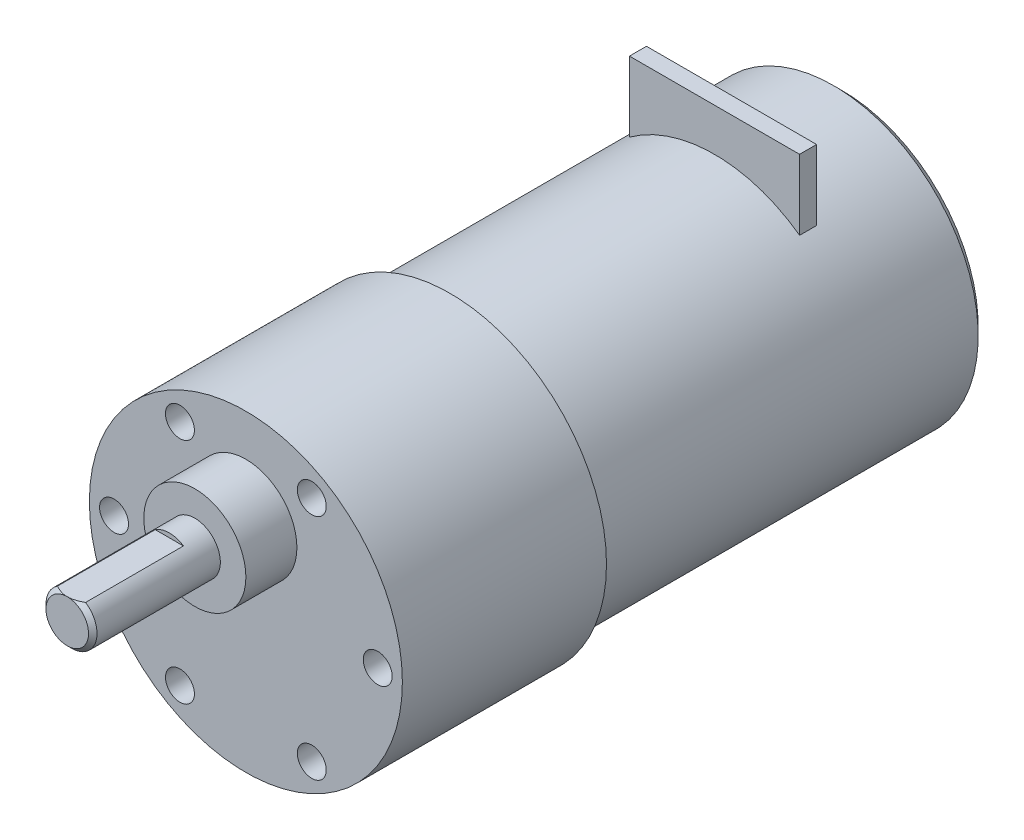
ISO-10303-21;
HEADER;
FILE_DESCRIPTION(('STEP AP214'),'2;1');
FILE_NAME('part.step','',(''),(''),'','','');
FILE_SCHEMA(('AUTOMOTIVE_DESIGN { 1 0 10303 214 1 1 1 1 }'));
ENDSEC;
DATA;
#1=APPLICATION_CONTEXT('core data for automotive mechanical design processes');
#2=APPLICATION_PROTOCOL_DEFINITION('international standard','automotive_design',2000,#1);
#3=PRODUCT_CONTEXT('',#1,'mechanical');
#4=PRODUCT('Part','Part','',(#3));
#5=PRODUCT_RELATED_PRODUCT_CATEGORY('part','',(#4));
#6=PRODUCT_DEFINITION_FORMATION('','',#4);
#7=PRODUCT_DEFINITION_CONTEXT('part definition',#1,'design');
#8=PRODUCT_DEFINITION('design','',#6,#7);
#9=PRODUCT_DEFINITION_SHAPE('','',#8);
#10=(LENGTH_UNIT() NAMED_UNIT(*) SI_UNIT(.MILLI.,.METRE.));
#11=(NAMED_UNIT(*) PLANE_ANGLE_UNIT() SI_UNIT($,.RADIAN.));
#12=(NAMED_UNIT(*) SI_UNIT($,.STERADIAN.) SOLID_ANGLE_UNIT());
#13=UNCERTAINTY_MEASURE_WITH_UNIT(LENGTH_MEASURE(1.E-05),#10,'distance_accuracy_value','');
#14=(GEOMETRIC_REPRESENTATION_CONTEXT(3) GLOBAL_UNCERTAINTY_ASSIGNED_CONTEXT((#13)) GLOBAL_UNIT_ASSIGNED_CONTEXT((#10,
#11,#12)) REPRESENTATION_CONTEXT('',''));
#15=CARTESIAN_POINT('',(0.,0.,0.));
#16=DIRECTION('',(0.,0.,1.));
#17=DIRECTION('',(1.,0.,0.));
#18=AXIS2_PLACEMENT_3D('',#15,#16,#17);
#19=CARTESIAN_POINT('',(0.,0.,-46.1));
#20=DIRECTION('',(0.,0.,1.));
#21=DIRECTION('',(1.,0.,0.));
#22=AXIS2_PLACEMENT_3D('',#19,#20,#21);
#23=CYLINDRICAL_SURFACE('',#22,17.);
#24=CARTESIAN_POINT('',(0.,0.,0.));
#25=DIRECTION('',(0.,0.,-1.));
#26=DIRECTION('',(-1.,0.,0.));
#27=AXIS2_PLACEMENT_3D('',#24,#25,#26);
#28=CIRCLE('',#27,17.);
#29=CARTESIAN_POINT('',(-17.,0.,0.));
#30=VERTEX_POINT('',#29);
#31=EDGE_CURVE('E198',#30,#30,#28,.T.);
#32=ORIENTED_EDGE('',*,*,#31,.T.);
#33=EDGE_LOOP('',(#32));
#34=FACE_BOUND('',#33,.T.);
#35=CARTESIAN_POINT('',(0.,0.,-45.1));
#36=DIRECTION('',(0.,0.,-1.));
#37=DIRECTION('',(-1.,0.,0.));
#38=AXIS2_PLACEMENT_3D('',#35,#36,#37);
#39=CIRCLE('',#38,17.);
#40=CARTESIAN_POINT('',(-17.,0.,-45.1));
#41=VERTEX_POINT('',#40);
#42=EDGE_CURVE('E191',#41,#41,#39,.F.);
#43=ORIENTED_EDGE('',*,*,#42,.T.);
#44=EDGE_LOOP('',(#43));
#45=FACE_BOUND('',#44,.T.);
#46=DIRECTION('',(0.,0.,1.));
#47=VECTOR('',#46,1.);
#48=CARTESIAN_POINT('',(-10.,13.7477270848675,-46.1));
#49=LINE('',#48,#47);
#50=CARTESIAN_POINT('',(-10.,13.7477270848675,-33.1));
#51=VERTEX_POINT('',#50);
#52=CARTESIAN_POINT('',(-10.,13.7477270848675,-31.1));
#53=VERTEX_POINT('',#52);
#54=EDGE_CURVE('E11',#51,#53,#49,.T.);
#55=ORIENTED_EDGE('',*,*,#54,.F.);
#56=CARTESIAN_POINT('',(0.,0.,-33.1));
#57=DIRECTION('',(0.,0.,1.));
#58=DIRECTION('',(1.,0.,0.));
#59=AXIS2_PLACEMENT_3D('',#56,#57,#58);
#60=CIRCLE('',#59,17.);
#61=CARTESIAN_POINT('',(10.,13.7477270848675,-33.1));
#62=VERTEX_POINT('',#61);
#63=EDGE_CURVE('E283',#62,#51,#60,.T.);
#64=ORIENTED_EDGE('',*,*,#63,.F.);
#65=DIRECTION('',(0.,0.,1.));
#66=VECTOR('',#65,1.);
#67=CARTESIAN_POINT('',(10.,13.7477270848675,-46.1));
#68=LINE('',#67,#66);
#69=CARTESIAN_POINT('',(10.,13.7477270848675,-31.1));
#70=VERTEX_POINT('',#69);
#71=EDGE_CURVE('E61',#70,#62,#68,.F.);
#72=ORIENTED_EDGE('',*,*,#71,.F.);
#73=CARTESIAN_POINT('',(0.,0.,-31.1));
#74=DIRECTION('',(0.,0.,-1.));
#75=DIRECTION('',(-1.,0.,0.));
#76=AXIS2_PLACEMENT_3D('',#73,#74,#75);
#77=CIRCLE('',#76,17.);
#78=EDGE_CURVE('E51',#53,#70,#77,.T.);
#79=ORIENTED_EDGE('',*,*,#78,.F.);
#80=EDGE_LOOP('',(#55,#64,#72,#79));
#81=FACE_BOUND('',#80,.T.);
#82=ADVANCED_FACE('F41',(#34,#45,#81),#23,.T.);
#83=CARTESIAN_POINT('',(0.,0.,24.));
#84=DIRECTION('',(0.,0.,-1.));
#85=DIRECTION('',(-1.,0.,0.));
#86=AXIS2_PLACEMENT_3D('',#83,#84,#85);
#87=CYLINDRICAL_SURFACE('',#86,18.4);
#88=CARTESIAN_POINT('',(0.,0.,24.));
#89=DIRECTION('',(0.,0.,1.));
#90=DIRECTION('',(1.,0.,0.));
#91=AXIS2_PLACEMENT_3D('',#88,#89,#90);
#92=CIRCLE('',#91,18.4);
#93=CARTESIAN_POINT('',(18.4,0.,24.));
#94=VERTEX_POINT('',#93);
#95=EDGE_CURVE('E202',#94,#94,#92,.T.);
#96=ORIENTED_EDGE('',*,*,#95,.F.);
#97=EDGE_LOOP('',(#96));
#98=FACE_BOUND('',#97,.T.);
#99=CARTESIAN_POINT('',(0.,0.,0.));
#100=DIRECTION('',(0.,0.,1.));
#101=DIRECTION('',(1.,0.,0.));
#102=AXIS2_PLACEMENT_3D('',#99,#100,#101);
#103=CIRCLE('',#102,18.4);
#104=CARTESIAN_POINT('',(18.4,0.,0.));
#105=VERTEX_POINT('',#104);
#106=EDGE_CURVE('E195',#105,#105,#103,.T.);
#107=ORIENTED_EDGE('',*,*,#106,.T.);
#108=EDGE_LOOP('',(#107));
#109=FACE_BOUND('',#108,.T.);
#110=ADVANCED_FACE('F260',(#98,#109),#87,.T.);
#111=CARTESIAN_POINT('',(0.,0.,24.));
#112=DIRECTION('',(0.,0.,1.));
#113=DIRECTION('',(1.,0.,0.));
#114=AXIS2_PLACEMENT_3D('',#111,#112,#113);
#115=PLANE('',#114);
#116=CARTESIAN_POINT('',(-7.75000000000016,-13.4233937586587,24.));
#117=DIRECTION('',(0.,0.,1.));
#118=DIRECTION('',(1.,0.,0.));
#119=AXIS2_PLACEMENT_3D('',#116,#117,#118);
#120=CIRCLE('',#119,1.69999999999999);
#121=CARTESIAN_POINT('',(-6.05000000000017,-13.4233937586587,24.));
#122=VERTEX_POINT('',#121);
#123=EDGE_CURVE('E134',#122,#122,#120,.T.);
#124=ORIENTED_EDGE('',*,*,#123,.F.);
#125=EDGE_LOOP('',(#124));
#126=FACE_BOUND('',#125,.T.);
#127=CARTESIAN_POINT('',(7.74999999999987,-13.4233937586589,24.));
#128=DIRECTION('',(0.,0.,1.));
#129=DIRECTION('',(1.,0.,0.));
#130=AXIS2_PLACEMENT_3D('',#127,#128,#129);
#131=CIRCLE('',#130,1.69999999999999);
#132=CARTESIAN_POINT('',(9.44999999999986,-13.4233937586589,24.));
#133=VERTEX_POINT('',#132);
#134=EDGE_CURVE('E145',#133,#133,#131,.T.);
#135=ORIENTED_EDGE('',*,*,#134,.F.);
#136=EDGE_LOOP('',(#135));
#137=FACE_BOUND('',#136,.T.);
#138=CARTESIAN_POINT('',(15.5,0.,24.));
#139=DIRECTION('',(0.,0.,1.));
#140=DIRECTION('',(1.,0.,0.));
#141=AXIS2_PLACEMENT_3D('',#138,#139,#140);
#142=CIRCLE('',#141,1.69999999999999);
#143=CARTESIAN_POINT('',(17.2,0.,24.));
#144=VERTEX_POINT('',#143);
#145=EDGE_CURVE('E151',#144,#144,#142,.T.);
#146=ORIENTED_EDGE('',*,*,#145,.F.);
#147=EDGE_LOOP('',(#146));
#148=FACE_BOUND('',#147,.T.);
#149=CARTESIAN_POINT('',(7.75000000000006,13.4233937586588,24.));
#150=DIRECTION('',(0.,0.,1.));
#151=DIRECTION('',(1.,0.,0.));
#152=AXIS2_PLACEMENT_3D('',#149,#150,#151);
#153=CIRCLE('',#152,1.69999999999999);
#154=CARTESIAN_POINT('',(9.45000000000005,13.4233937586588,24.));
#155=VERTEX_POINT('',#154);
#156=EDGE_CURVE('E157',#155,#155,#153,.T.);
#157=ORIENTED_EDGE('',*,*,#156,.F.);
#158=EDGE_LOOP('',(#157));
#159=FACE_BOUND('',#158,.T.);
#160=CARTESIAN_POINT('',(-7.74999999999997,13.4233937586588,24.));
#161=DIRECTION('',(0.,0.,1.));
#162=DIRECTION('',(1.,0.,0.));
#163=AXIS2_PLACEMENT_3D('',#160,#161,#162);
#164=CIRCLE('',#163,1.69999999999999);
#165=CARTESIAN_POINT('',(-6.04999999999998,13.4233937586588,24.));
#166=VERTEX_POINT('',#165);
#167=EDGE_CURVE('E163',#166,#166,#164,.T.);
#168=ORIENTED_EDGE('',*,*,#167,.F.);
#169=EDGE_LOOP('',(#168));
#170=FACE_BOUND('',#169,.T.);
#171=CARTESIAN_POINT('',(-15.5,0.,24.));
#172=DIRECTION('',(0.,0.,1.));
#173=DIRECTION('',(1.,0.,0.));
#174=AXIS2_PLACEMENT_3D('',#171,#172,#173);
#175=CIRCLE('',#174,1.69999999999999);
#176=CARTESIAN_POINT('',(-13.8,0.,24.));
#177=VERTEX_POINT('',#176);
#178=EDGE_CURVE('E169',#177,#177,#175,.T.);
#179=ORIENTED_EDGE('',*,*,#178,.F.);
#180=EDGE_LOOP('',(#179));
#181=FACE_BOUND('',#180,.T.);
#182=CARTESIAN_POINT('',(0.,7.5,24.));
#183=DIRECTION('',(0.,0.,1.));
#184=DIRECTION('',(1.,0.,0.));
#185=AXIS2_PLACEMENT_3D('',#182,#183,#184);
#186=CIRCLE('',#185,6.);
#187=CARTESIAN_POINT('',(6.,7.5,24.));
#188=VERTEX_POINT('',#187);
#189=EDGE_CURVE('E184',#188,#188,#186,.T.);
#190=ORIENTED_EDGE('',*,*,#189,.F.);
#191=EDGE_LOOP('',(#190));
#192=FACE_BOUND('',#191,.T.);
#193=ORIENTED_EDGE('',*,*,#95,.T.);
#194=EDGE_LOOP('',(#193));
#195=FACE_BOUND('',#194,.T.);
#196=ADVANCED_FACE('F262',(#126,#137,#148,#159,#170,#181,#192,#195),#115,.T.);
#197=CARTESIAN_POINT('',(0.,0.,0.));
#198=DIRECTION('',(0.,0.,1.));
#199=DIRECTION('',(1.,0.,0.));
#200=AXIS2_PLACEMENT_3D('',#197,#198,#199);
#201=PLANE('',#200);
#202=ORIENTED_EDGE('',*,*,#31,.F.);
#203=EDGE_LOOP('',(#202));
#204=FACE_BOUND('',#203,.T.);
#205=ORIENTED_EDGE('',*,*,#106,.F.);
#206=EDGE_LOOP('',(#205));
#207=FACE_BOUND('',#206,.T.);
#208=ADVANCED_FACE('F256',(#204,#207),#201,.F.);
#209=CARTESIAN_POINT('',(0.,0.,-46.1));
#210=DIRECTION('',(0.,0.,-1.));
#211=DIRECTION('',(-1.,0.,0.));
#212=AXIS2_PLACEMENT_3D('',#209,#210,#211);
#213=PLANE('',#212);
#214=CARTESIAN_POINT('',(0.,0.,-46.1));
#215=DIRECTION('',(0.,0.,-1.));
#216=DIRECTION('',(-1.,0.,0.));
#217=AXIS2_PLACEMENT_3D('',#214,#215,#216);
#218=CIRCLE('',#217,16.);
#219=CARTESIAN_POINT('',(-16.,0.,-46.1));
#220=VERTEX_POINT('',#219);
#221=EDGE_CURVE('E201',#220,#220,#218,.T.);
#222=ORIENTED_EDGE('',*,*,#221,.T.);
#223=EDGE_LOOP('',(#222));
#224=FACE_BOUND('',#223,.T.);
#225=ADVANCED_FACE('F253',(#224),#213,.T.);
#226=CARTESIAN_POINT('',(0.,0.,-46.1));
#227=DIRECTION('',(0.,0.,1.));
#228=DIRECTION('',(1.,0.,0.));
#229=AXIS2_PLACEMENT_3D('',#226,#227,#228);
#230=CONICAL_SURFACE('',#229,16.,0.785398163397448);
#231=ORIENTED_EDGE('',*,*,#42,.F.);
#232=EDGE_LOOP('',(#231));
#233=FACE_BOUND('',#232,.T.);
#234=ORIENTED_EDGE('',*,*,#221,.F.);
#235=EDGE_LOOP('',(#234));
#236=FACE_BOUND('',#235,.T.);
#237=ADVANCED_FACE('F251',(#233,#236),#230,.T.);
#238=CARTESIAN_POINT('',(0.,7.5,30.));
#239=DIRECTION('',(0.,0.,-1.));
#240=DIRECTION('',(-1.,0.,0.));
#241=AXIS2_PLACEMENT_3D('',#238,#239,#240);
#242=CYLINDRICAL_SURFACE('',#241,6.);
#243=CARTESIAN_POINT('',(0.,7.5,30.));
#244=DIRECTION('',(0.,0.,1.));
#245=DIRECTION('',(1.,0.,0.));
#246=AXIS2_PLACEMENT_3D('',#243,#244,#245);
#247=CIRCLE('',#246,6.);
#248=CARTESIAN_POINT('',(6.,7.5,30.));
#249=VERTEX_POINT('',#248);
#250=EDGE_CURVE('E192',#249,#249,#247,.T.);
#251=ORIENTED_EDGE('',*,*,#250,.F.);
#252=EDGE_LOOP('',(#251));
#253=FACE_BOUND('',#252,.T.);
#254=ORIENTED_EDGE('',*,*,#189,.T.);
#255=EDGE_LOOP('',(#254));
#256=FACE_BOUND('',#255,.T.);
#257=ADVANCED_FACE('F247',(#253,#256),#242,.T.);
#258=CARTESIAN_POINT('',(0.,7.5,30.));
#259=DIRECTION('',(0.,0.,1.));
#260=DIRECTION('',(1.,0.,0.));
#261=AXIS2_PLACEMENT_3D('',#258,#259,#260);
#262=PLANE('',#261);
#263=CARTESIAN_POINT('',(0.,7.5,30.));
#264=DIRECTION('',(0.,0.,1.));
#265=DIRECTION('',(1.,0.,0.));
#266=AXIS2_PLACEMENT_3D('',#263,#264,#265);
#267=CIRCLE('',#266,3.);
#268=CARTESIAN_POINT('',(3.,7.5,30.));
#269=VERTEX_POINT('',#268);
#270=EDGE_CURVE('E187',#269,#269,#267,.T.);
#271=ORIENTED_EDGE('',*,*,#270,.F.);
#272=EDGE_LOOP('',(#271));
#273=FACE_BOUND('',#272,.T.);
#274=ORIENTED_EDGE('',*,*,#250,.T.);
#275=EDGE_LOOP('',(#274));
#276=FACE_BOUND('',#275,.T.);
#277=ADVANCED_FACE('F243',(#273,#276),#262,.T.);
#278=CARTESIAN_POINT('',(0.,7.5,45.));
#279=DIRECTION('',(0.,0.,-1.));
#280=DIRECTION('',(-1.,0.,0.));
#281=AXIS2_PLACEMENT_3D('',#278,#279,#280);
#282=CYLINDRICAL_SURFACE('',#281,3.);
#283=DIRECTION('',(0.,0.,1.));
#284=VECTOR('',#283,1.);
#285=CARTESIAN_POINT('',(1.6583123951777,10.,33.));
#286=LINE('',#285,#284);
#287=CARTESIAN_POINT('',(1.6583123951777,10.,33.));
#288=VERTEX_POINT('',#287);
#289=CARTESIAN_POINT('',(1.6583123951777,10.,44.5));
#290=VERTEX_POINT('',#289);
#291=EDGE_CURVE('E181',#288,#290,#286,.T.);
#292=ORIENTED_EDGE('',*,*,#291,.T.);
#293=CARTESIAN_POINT('',(0.,7.5,44.5));
#294=DIRECTION('',(0.,0.,1.));
#295=DIRECTION('',(1.,0.,0.));
#296=AXIS2_PLACEMENT_3D('',#293,#294,#295);
#297=CIRCLE('',#296,3.);
#298=CARTESIAN_POINT('',(-1.6583123951777,10.,44.5));
#299=VERTEX_POINT('',#298);
#300=EDGE_CURVE('E289',#290,#299,#297,.F.);
#301=ORIENTED_EDGE('',*,*,#300,.T.);
#302=DIRECTION('',(0.,0.,1.));
#303=VECTOR('',#302,1.);
#304=CARTESIAN_POINT('',(-1.6583123951777,10.,33.));
#305=LINE('',#304,#303);
#306=CARTESIAN_POINT('',(-1.6583123951777,10.,33.));
#307=VERTEX_POINT('',#306);
#308=EDGE_CURVE('E180',#307,#299,#305,.T.);
#309=ORIENTED_EDGE('',*,*,#308,.F.);
#310=CARTESIAN_POINT('',(0.,7.5,33.));
#311=DIRECTION('',(0.,0.,1.));
#312=DIRECTION('',(1.,0.,0.));
#313=AXIS2_PLACEMENT_3D('',#310,#311,#312);
#314=CIRCLE('',#313,3.);
#315=EDGE_CURVE('E175',#288,#307,#314,.T.);
#316=ORIENTED_EDGE('',*,*,#315,.F.);
#317=EDGE_LOOP('',(#292,#301,#309,#316));
#318=FACE_BOUND('',#317,.T.);
#319=ORIENTED_EDGE('',*,*,#270,.T.);
#320=EDGE_LOOP('',(#319));
#321=FACE_BOUND('',#320,.T.);
#322=ADVANCED_FACE('F239',(#318,#321),#282,.T.);
#323=CARTESIAN_POINT('',(0.,7.5,45.));
#324=DIRECTION('',(0.,0.,1.));
#325=DIRECTION('',(1.,0.,0.));
#326=AXIS2_PLACEMENT_3D('',#323,#324,#325);
#327=PLANE('',#326);
#328=CARTESIAN_POINT('',(0.,7.5,45.));
#329=DIRECTION('',(0.,0.,1.));
#330=DIRECTION('',(1.,0.,0.));
#331=AXIS2_PLACEMENT_3D('',#328,#329,#330);
#332=CIRCLE('',#331,2.49999999999998);
#333=CARTESIAN_POINT('',(0.,10.,45.));
#334=VERTEX_POINT('',#333);
#335=EDGE_CURVE('E190',#334,#334,#332,.T.);
#336=ORIENTED_EDGE('',*,*,#335,.T.);
#337=EDGE_LOOP('',(#336));
#338=FACE_BOUND('',#337,.T.);
#339=ADVANCED_FACE('F233',(#338),#327,.T.);
#340=CARTESIAN_POINT('',(0.,10.,33.));
#341=DIRECTION('',(0.,-1.,0.));
#342=DIRECTION('',(0.,0.,-1.));
#343=AXIS2_PLACEMENT_3D('',#340,#341,#342);
#344=PLANE('',#343);
#345=CARTESIAN_POINT('',(-1.6583123951777,10.,44.5));
#346=CARTESIAN_POINT('',(-1.61304419071273,10.,44.5250200255843));
#347=CARTESIAN_POINT('',(-1.56747781751027,10.,44.5494994272189));
#348=CARTESIAN_POINT('',(-1.47571363154992,10.,44.5972096867305));
#349=CARTESIAN_POINT('',(-1.42951600534283,10.,44.6204409038781));
#350=CARTESIAN_POINT('',(-1.28946898250347,10.,44.688233741468));
#351=CARTESIAN_POINT('',(-1.19456817295725,10.,44.7306685534991));
#352=CARTESIAN_POINT('',(-1.00435832661105,10.,44.8071641313578));
#353=CARTESIAN_POINT('',(-0.909128166857113,10.,44.8414185932365));
#354=CARTESIAN_POINT('',(-0.715960996402801,10.,44.9011186383457));
#355=CARTESIAN_POINT('',(-0.618025975916636,10.,44.9265705213043));
#356=CARTESIAN_POINT('',(-0.434096531038001,10.,44.96395141614));
#357=CARTESIAN_POINT('',(-0.348395131920394,10.,44.9772928993308));
#358=CARTESIAN_POINT('',(-0.218706232970862,10.,44.99082665433));
#359=CARTESIAN_POINT('',(-0.175042274887075,10.,44.9942588205655));
#360=CARTESIAN_POINT('',(-0.0875881850216949,10.,44.9988484547413));
#361=CARTESIAN_POINT('',(-0.043798033754819,10.,45.0000055502065));
#362=CARTESIAN_POINT('',(0.,10.,45.));
#363=B_SPLINE_CURVE_WITH_KNOTS('',3,(#345,#346,#347,#348,#349,#350,#351,#352,#353,#354,#355,
#356,#357,#358,#359,#360,#361,#362),.UNSPECIFIED.,.F.,.F.,(4,2,2,2,2,2,2,2,4),(0.,
0.155160114661544,0.310275326953935,0.621889187467569,0.925164565305234,1.22822244720193,
1.48798349653102,1.61932602447731,1.75069005406606),.UNSPECIFIED.);
#364=EDGE_CURVE('E213',#299,#334,#363,.T.);
#365=ORIENTED_EDGE('',*,*,#364,.T.);
#366=CARTESIAN_POINT('',(0.,9.99999999999997,45.));
#367=CARTESIAN_POINT('',(0.0768428391803907,9.99999999999999,45.0000643176381));
#368=CARTESIAN_POINT('',(0.153646619440304,10.,44.9964585669139));
#369=CARTESIAN_POINT('',(0.30648691399063,10.,44.9824138186156));
#370=CARTESIAN_POINT('',(0.382524604614592,10.,44.9719877566791));
#371=CARTESIAN_POINT('',(0.532231201598342,10.,44.9450231886171));
#372=CARTESIAN_POINT('',(0.605918543015126,10.,44.9285851348585));
#373=CARTESIAN_POINT('',(0.751897163106769,10.,44.8903277696489));
#374=CARTESIAN_POINT('',(0.824187885624653,10.,44.8685063602176));
#375=CARTESIAN_POINT('',(0.961361204559374,10.,44.8222417065684));
#376=CARTESIAN_POINT('',(1.02636662586388,10.,44.7981581621012));
#377=CARTESIAN_POINT('',(1.1550556235554,10.,44.7466971992363));
#378=CARTESIAN_POINT('',(1.21873914323977,10.,44.7193196398836));
#379=CARTESIAN_POINT('',(1.34581351001768,10.,44.6613450460911));
#380=CARTESIAN_POINT('',(1.40918435962137,10.,44.6307045192353));
#381=CARTESIAN_POINT('',(1.53466113602633,10.,44.567035036112));
#382=CARTESIAN_POINT('',(1.59676793059764,10.,44.5340077944288));
#383=CARTESIAN_POINT('',(1.6583123951777,10.,44.5));
#384=B_SPLINE_CURVE_WITH_KNOTS('',3,(#366,#367,#368,#369,#370,#371,#372,#373,#374,#375,#376,
#377,#378,#379,#380,#381,#382,#383),.UNSPECIFIED.,.F.,.F.,(4,2,2,2,2,2,2,2,4),(0.,
0.230381722715165,0.460327757459299,0.686595219702824,0.912951001700763,1.12081935764501,
1.32869661170078,1.53981070703046,1.75077462023261),.UNSPECIFIED.);
#385=EDGE_CURVE('E221',#334,#290,#384,.T.);
#386=ORIENTED_EDGE('',*,*,#385,.T.);
#387=ORIENTED_EDGE('',*,*,#291,.F.);
#388=DIRECTION('',(1.,0.,0.));
#389=VECTOR('',#388,1.);
#390=CARTESIAN_POINT('',(0.,10.,33.));
#391=LINE('',#390,#389);
#392=EDGE_CURVE('E177',#307,#288,#391,.T.);
#393=ORIENTED_EDGE('',*,*,#392,.F.);
#394=ORIENTED_EDGE('',*,*,#308,.T.);
#395=EDGE_LOOP('',(#365,#386,#387,#393,#394));
#396=FACE_BOUND('',#395,.T.);
#397=ADVANCED_FACE('F227',(#396),#344,.F.);
#398=CARTESIAN_POINT('',(0.,0.,33.));
#399=DIRECTION('',(0.,0.,1.));
#400=DIRECTION('',(1.,0.,0.));
#401=AXIS2_PLACEMENT_3D('',#398,#399,#400);
#402=PLANE('',#401);
#403=ORIENTED_EDGE('',*,*,#315,.T.);
#404=ORIENTED_EDGE('',*,*,#392,.T.);
#405=EDGE_LOOP('',(#403,#404));
#406=FACE_BOUND('',#405,.T.);
#407=ADVANCED_FACE('F232',(#406),#402,.T.);
#408=CARTESIAN_POINT('',(0.,7.5,45.));
#409=DIRECTION('',(0.,0.,-1.));
#410=DIRECTION('',(-1.,0.,0.));
#411=AXIS2_PLACEMENT_3D('',#408,#409,#410);
#412=CONICAL_SURFACE('',#411,2.49999999999997,0.785398163397452);
#413=ORIENTED_EDGE('',*,*,#364,.F.);
#414=ORIENTED_EDGE('',*,*,#300,.F.);
#415=ORIENTED_EDGE('',*,*,#385,.F.);
#416=ORIENTED_EDGE('',*,*,#335,.F.);
#417=EDGE_LOOP('',(#413,#414,#415,#416));
#418=FACE_BOUND('',#417,.T.);
#419=ADVANCED_FACE('F44',(#418),#412,.T.);
#420=CARTESIAN_POINT('',(-15.5,0.,20.5));
#421=DIRECTION('',(0.,0.,1.));
#422=DIRECTION('',(1.,0.,0.));
#423=AXIS2_PLACEMENT_3D('',#420,#421,#422);
#424=CONICAL_SURFACE('',#423,1.7,1.02974425867665);
#425=CARTESIAN_POINT('',(-15.5,0.,19.4785369476531));
#426=VERTEX_POINT('',#425);
#427=VERTEX_LOOP('',#426);
#428=FACE_BOUND('',#427,.T.);
#429=CARTESIAN_POINT('',(-15.5,0.,20.5));
#430=DIRECTION('',(0.,0.,1.));
#431=DIRECTION('',(1.,0.,0.));
#432=AXIS2_PLACEMENT_3D('',#429,#430,#431);
#433=CIRCLE('',#432,1.7);
#434=CARTESIAN_POINT('',(-13.8,0.,20.5));
#435=VERTEX_POINT('',#434);
#436=EDGE_CURVE('E172',#435,#435,#433,.T.);
#437=ORIENTED_EDGE('',*,*,#436,.T.);
#438=EDGE_LOOP('',(#437));
#439=FACE_BOUND('',#438,.T.);
#440=ADVANCED_FACE('F306',(#428,#439),#424,.F.);
#441=CARTESIAN_POINT('',(-15.5,0.,24.));
#442=DIRECTION('',(0.,0.,1.));
#443=DIRECTION('',(1.,0.,0.));
#444=AXIS2_PLACEMENT_3D('',#441,#442,#443);
#445=CYLINDRICAL_SURFACE('',#444,1.69999999999999);
#446=ORIENTED_EDGE('',*,*,#436,.F.);
#447=EDGE_LOOP('',(#446));
#448=FACE_BOUND('',#447,.T.);
#449=ORIENTED_EDGE('',*,*,#178,.T.);
#450=EDGE_LOOP('',(#449));
#451=FACE_BOUND('',#450,.T.);
#452=ADVANCED_FACE('F310',(#448,#451),#445,.F.);
#453=CARTESIAN_POINT('',(-7.74999999999997,13.4233937586588,20.5));
#454=DIRECTION('',(0.,0.,1.));
#455=DIRECTION('',(1.,0.,0.));
#456=AXIS2_PLACEMENT_3D('',#453,#454,#455);
#457=CONICAL_SURFACE('',#456,1.7,1.02974425867665);
#458=CARTESIAN_POINT('',(-7.74999999999997,13.4233937586588,19.4785369476531));
#459=VERTEX_POINT('',#458);
#460=VERTEX_LOOP('',#459);
#461=FACE_BOUND('',#460,.T.);
#462=CARTESIAN_POINT('',(-7.74999999999997,13.4233937586588,20.5));
#463=DIRECTION('',(0.,0.,1.));
#464=DIRECTION('',(1.,0.,0.));
#465=AXIS2_PLACEMENT_3D('',#462,#463,#464);
#466=CIRCLE('',#465,1.7);
#467=CARTESIAN_POINT('',(-6.04999999999997,13.4233937586588,20.5));
#468=VERTEX_POINT('',#467);
#469=EDGE_CURVE('E166',#468,#468,#466,.T.);
#470=ORIENTED_EDGE('',*,*,#469,.T.);
#471=EDGE_LOOP('',(#470));
#472=FACE_BOUND('',#471,.T.);
#473=ADVANCED_FACE('F353',(#461,#472),#457,.F.);
#474=CARTESIAN_POINT('',(-7.74999999999997,13.4233937586588,24.));
#475=DIRECTION('',(0.,0.,1.));
#476=DIRECTION('',(1.,0.,0.));
#477=AXIS2_PLACEMENT_3D('',#474,#475,#476);
#478=CYLINDRICAL_SURFACE('',#477,1.69999999999999);
#479=ORIENTED_EDGE('',*,*,#469,.F.);
#480=EDGE_LOOP('',(#479));
#481=FACE_BOUND('',#480,.T.);
#482=ORIENTED_EDGE('',*,*,#167,.T.);
#483=EDGE_LOOP('',(#482));
#484=FACE_BOUND('',#483,.T.);
#485=ADVANCED_FACE('F362',(#481,#484),#478,.F.);
#486=CARTESIAN_POINT('',(7.75000000000006,13.4233937586588,20.5));
#487=DIRECTION('',(0.,0.,1.));
#488=DIRECTION('',(1.,0.,0.));
#489=AXIS2_PLACEMENT_3D('',#486,#487,#488);
#490=CONICAL_SURFACE('',#489,1.7,1.02974425867665);
#491=CARTESIAN_POINT('',(7.75000000000006,13.4233937586588,19.4785369476531));
#492=VERTEX_POINT('',#491);
#493=VERTEX_LOOP('',#492);
#494=FACE_BOUND('',#493,.T.);
#495=CARTESIAN_POINT('',(7.75000000000006,13.4233937586588,20.5));
#496=DIRECTION('',(0.,0.,1.));
#497=DIRECTION('',(1.,0.,0.));
#498=AXIS2_PLACEMENT_3D('',#495,#496,#497);
#499=CIRCLE('',#498,1.7);
#500=CARTESIAN_POINT('',(9.45000000000006,13.4233937586588,20.5));
#501=VERTEX_POINT('',#500);
#502=EDGE_CURVE('E160',#501,#501,#499,.T.);
#503=ORIENTED_EDGE('',*,*,#502,.T.);
#504=EDGE_LOOP('',(#503));
#505=FACE_BOUND('',#504,.T.);
#506=ADVANCED_FACE('F371',(#494,#505),#490,.F.);
#507=CARTESIAN_POINT('',(7.75000000000006,13.4233937586588,24.));
#508=DIRECTION('',(0.,0.,1.));
#509=DIRECTION('',(1.,0.,0.));
#510=AXIS2_PLACEMENT_3D('',#507,#508,#509);
#511=CYLINDRICAL_SURFACE('',#510,1.69999999999999);
#512=ORIENTED_EDGE('',*,*,#502,.F.);
#513=EDGE_LOOP('',(#512));
#514=FACE_BOUND('',#513,.T.);
#515=ORIENTED_EDGE('',*,*,#156,.T.);
#516=EDGE_LOOP('',(#515));
#517=FACE_BOUND('',#516,.T.);
#518=ADVANCED_FACE('F380',(#514,#517),#511,.F.);
#519=CARTESIAN_POINT('',(15.5,0.,20.5));
#520=DIRECTION('',(0.,0.,1.));
#521=DIRECTION('',(1.,0.,0.));
#522=AXIS2_PLACEMENT_3D('',#519,#520,#521);
#523=CONICAL_SURFACE('',#522,1.7,1.02974425867665);
#524=CARTESIAN_POINT('',(15.5,0.,19.4785369476531));
#525=VERTEX_POINT('',#524);
#526=VERTEX_LOOP('',#525);
#527=FACE_BOUND('',#526,.T.);
#528=CARTESIAN_POINT('',(15.5,0.,20.5));
#529=DIRECTION('',(0.,0.,1.));
#530=DIRECTION('',(1.,0.,0.));
#531=AXIS2_PLACEMENT_3D('',#528,#529,#530);
#532=CIRCLE('',#531,1.7);
#533=CARTESIAN_POINT('',(17.2,0.,20.5));
#534=VERTEX_POINT('',#533);
#535=EDGE_CURVE('E154',#534,#534,#532,.T.);
#536=ORIENTED_EDGE('',*,*,#535,.T.);
#537=EDGE_LOOP('',(#536));
#538=FACE_BOUND('',#537,.T.);
#539=ADVANCED_FACE('F389',(#527,#538),#523,.F.);
#540=CARTESIAN_POINT('',(15.5,0.,24.));
#541=DIRECTION('',(0.,0.,1.));
#542=DIRECTION('',(1.,0.,0.));
#543=AXIS2_PLACEMENT_3D('',#540,#541,#542);
#544=CYLINDRICAL_SURFACE('',#543,1.69999999999999);
#545=ORIENTED_EDGE('',*,*,#535,.F.);
#546=EDGE_LOOP('',(#545));
#547=FACE_BOUND('',#546,.T.);
#548=ORIENTED_EDGE('',*,*,#145,.T.);
#549=EDGE_LOOP('',(#548));
#550=FACE_BOUND('',#549,.T.);
#551=ADVANCED_FACE('F398',(#547,#550),#544,.F.);
#552=CARTESIAN_POINT('',(7.74999999999987,-13.4233937586589,20.5));
#553=DIRECTION('',(0.,0.,1.));
#554=DIRECTION('',(1.,0.,0.));
#555=AXIS2_PLACEMENT_3D('',#552,#553,#554);
#556=CONICAL_SURFACE('',#555,1.7,1.02974425867665);
#557=CARTESIAN_POINT('',(7.74999999999987,-13.4233937586589,19.4785369476531));
#558=VERTEX_POINT('',#557);
#559=VERTEX_LOOP('',#558);
#560=FACE_BOUND('',#559,.T.);
#561=CARTESIAN_POINT('',(7.74999999999987,-13.4233937586589,20.5));
#562=DIRECTION('',(0.,0.,1.));
#563=DIRECTION('',(1.,0.,0.));
#564=AXIS2_PLACEMENT_3D('',#561,#562,#563);
#565=CIRCLE('',#564,1.7);
#566=CARTESIAN_POINT('',(9.44999999999987,-13.4233937586589,20.5));
#567=VERTEX_POINT('',#566);
#568=EDGE_CURVE('E148',#567,#567,#565,.T.);
#569=ORIENTED_EDGE('',*,*,#568,.T.);
#570=EDGE_LOOP('',(#569));
#571=FACE_BOUND('',#570,.T.);
#572=ADVANCED_FACE('F407',(#560,#571),#556,.F.);
#573=CARTESIAN_POINT('',(7.74999999999987,-13.4233937586589,24.));
#574=DIRECTION('',(0.,0.,1.));
#575=DIRECTION('',(1.,0.,0.));
#576=AXIS2_PLACEMENT_3D('',#573,#574,#575);
#577=CYLINDRICAL_SURFACE('',#576,1.69999999999999);
#578=ORIENTED_EDGE('',*,*,#568,.F.);
#579=EDGE_LOOP('',(#578));
#580=FACE_BOUND('',#579,.T.);
#581=ORIENTED_EDGE('',*,*,#134,.T.);
#582=EDGE_LOOP('',(#581));
#583=FACE_BOUND('',#582,.T.);
#584=ADVANCED_FACE('F416',(#580,#583),#577,.F.);
#585=CARTESIAN_POINT('',(-7.75000000000016,-13.4233937586587,20.5));
#586=DIRECTION('',(0.,0.,1.));
#587=DIRECTION('',(1.,0.,0.));
#588=AXIS2_PLACEMENT_3D('',#585,#586,#587);
#589=CONICAL_SURFACE('',#588,1.7,1.02974425867665);
#590=CARTESIAN_POINT('',(-7.75000000000016,-13.4233937586587,19.4785369476531));
#591=VERTEX_POINT('',#590);
#592=VERTEX_LOOP('',#591);
#593=FACE_BOUND('',#592,.T.);
#594=CARTESIAN_POINT('',(-7.75000000000016,-13.4233937586587,20.5));
#595=DIRECTION('',(0.,0.,1.));
#596=DIRECTION('',(1.,0.,0.));
#597=AXIS2_PLACEMENT_3D('',#594,#595,#596);
#598=CIRCLE('',#597,1.7);
#599=CARTESIAN_POINT('',(-6.05000000000016,-13.4233937586587,20.5));
#600=VERTEX_POINT('',#599);
#601=EDGE_CURVE('E137',#600,#600,#598,.T.);
#602=ORIENTED_EDGE('',*,*,#601,.T.);
#603=EDGE_LOOP('',(#602));
#604=FACE_BOUND('',#603,.T.);
#605=ADVANCED_FACE('F425',(#593,#604),#589,.F.);
#606=CARTESIAN_POINT('',(-7.75000000000016,-13.4233937586587,24.));
#607=DIRECTION('',(0.,0.,1.));
#608=DIRECTION('',(1.,0.,0.));
#609=AXIS2_PLACEMENT_3D('',#606,#607,#608);
#610=CYLINDRICAL_SURFACE('',#609,1.69999999999999);
#611=ORIENTED_EDGE('',*,*,#601,.F.);
#612=EDGE_LOOP('',(#611));
#613=FACE_BOUND('',#612,.T.);
#614=ORIENTED_EDGE('',*,*,#123,.T.);
#615=EDGE_LOOP('',(#614));
#616=FACE_BOUND('',#615,.T.);
#617=ADVANCED_FACE('F434',(#613,#616),#610,.F.);
#618=CARTESIAN_POINT('',(-10.,22.,-33.1));
#619=DIRECTION('',(1.,0.,0.));
#620=DIRECTION('',(0.,0.,-1.));
#621=AXIS2_PLACEMENT_3D('',#618,#619,#620);
#622=PLANE('',#621);
#623=DIRECTION('',(0.,-1.,0.));
#624=VECTOR('',#623,1.);
#625=CARTESIAN_POINT('',(-10.,22.,-33.1));
#626=LINE('',#625,#624);
#627=CARTESIAN_POINT('',(-10.,22.,-33.1));
#628=VERTEX_POINT('',#627);
#629=EDGE_CURVE('E287',#628,#51,#626,.T.);
#630=ORIENTED_EDGE('',*,*,#629,.T.);
#631=ORIENTED_EDGE('',*,*,#54,.T.);
#632=DIRECTION('',(0.,-1.,0.));
#633=VECTOR('',#632,1.);
#634=CARTESIAN_POINT('',(-10.,22.,-31.1));
#635=LINE('',#634,#633);
#636=CARTESIAN_POINT('',(-10.,22.,-31.1));
#637=VERTEX_POINT('',#636);
#638=EDGE_CURVE('E117',#637,#53,#635,.T.);
#639=ORIENTED_EDGE('',*,*,#638,.F.);
#640=DIRECTION('',(0.,0.,1.));
#641=VECTOR('',#640,1.);
#642=CARTESIAN_POINT('',(-10.,22.,-33.1));
#643=LINE('',#642,#641);
#644=EDGE_CURVE('E123',#628,#637,#643,.T.);
#645=ORIENTED_EDGE('',*,*,#644,.F.);
#646=EDGE_LOOP('',(#630,#631,#639,#645));
#647=FACE_BOUND('',#646,.T.);
#648=ADVANCED_FACE('F133',(#647),#622,.F.);
#649=CARTESIAN_POINT('',(10.,22.,-33.1));
#650=DIRECTION('',(-1.,0.,0.));
#651=DIRECTION('',(0.,0.,1.));
#652=AXIS2_PLACEMENT_3D('',#649,#650,#651);
#653=PLANE('',#652);
#654=DIRECTION('',(0.,-1.,0.));
#655=VECTOR('',#654,1.);
#656=CARTESIAN_POINT('',(10.,22.,-31.1));
#657=LINE('',#656,#655);
#658=CARTESIAN_POINT('',(10.,22.,-31.1));
#659=VERTEX_POINT('',#658);
#660=EDGE_CURVE('E119',#659,#70,#657,.T.);
#661=ORIENTED_EDGE('',*,*,#660,.T.);
#662=ORIENTED_EDGE('',*,*,#71,.T.);
#663=DIRECTION('',(0.,-1.,0.));
#664=VECTOR('',#663,1.);
#665=CARTESIAN_POINT('',(10.,22.,-33.1));
#666=LINE('',#665,#664);
#667=CARTESIAN_POINT('',(10.,22.,-33.1));
#668=VERTEX_POINT('',#667);
#669=EDGE_CURVE('E139',#668,#62,#666,.T.);
#670=ORIENTED_EDGE('',*,*,#669,.F.);
#671=DIRECTION('',(0.,0.,-1.));
#672=VECTOR('',#671,1.);
#673=CARTESIAN_POINT('',(10.,22.,-33.1));
#674=LINE('',#673,#672);
#675=EDGE_CURVE('E122',#659,#668,#674,.T.);
#676=ORIENTED_EDGE('',*,*,#675,.F.);
#677=EDGE_LOOP('',(#661,#662,#670,#676));
#678=FACE_BOUND('',#677,.T.);
#679=ADVANCED_FACE('F295',(#678),#653,.F.);
#680=CARTESIAN_POINT('',(-10.,22.,-31.1));
#681=DIRECTION('',(0.,0.,-1.));
#682=DIRECTION('',(-1.,0.,0.));
#683=AXIS2_PLACEMENT_3D('',#680,#681,#682);
#684=PLANE('',#683);
#685=ORIENTED_EDGE('',*,*,#638,.T.);
#686=ORIENTED_EDGE('',*,*,#78,.T.);
#687=ORIENTED_EDGE('',*,*,#660,.F.);
#688=DIRECTION('',(1.,0.,0.));
#689=VECTOR('',#688,1.);
#690=CARTESIAN_POINT('',(-10.,22.,-31.1));
#691=LINE('',#690,#689);
#692=EDGE_CURVE('E113',#637,#659,#691,.T.);
#693=ORIENTED_EDGE('',*,*,#692,.F.);
#694=EDGE_LOOP('',(#685,#686,#687,#693));
#695=FACE_BOUND('',#694,.T.);
#696=ADVANCED_FACE('F115',(#695),#684,.F.);
#697=CARTESIAN_POINT('',(-10.,22.,-33.1));
#698=DIRECTION('',(0.,0.,1.));
#699=DIRECTION('',(1.,0.,0.));
#700=AXIS2_PLACEMENT_3D('',#697,#698,#699);
#701=PLANE('',#700);
#702=ORIENTED_EDGE('',*,*,#669,.T.);
#703=ORIENTED_EDGE('',*,*,#63,.T.);
#704=ORIENTED_EDGE('',*,*,#629,.F.);
#705=DIRECTION('',(-1.,0.,0.));
#706=VECTOR('',#705,1.);
#707=CARTESIAN_POINT('',(-10.,22.,-33.1));
#708=LINE('',#707,#706);
#709=EDGE_CURVE('E128',#668,#628,#708,.T.);
#710=ORIENTED_EDGE('',*,*,#709,.F.);
#711=EDGE_LOOP('',(#702,#703,#704,#710));
#712=FACE_BOUND('',#711,.T.);
#713=ADVANCED_FACE('F286',(#712),#701,.F.);
#714=CARTESIAN_POINT('',(0.,22.,0.));
#715=DIRECTION('',(0.,1.,0.));
#716=DIRECTION('',(0.,0.,1.));
#717=AXIS2_PLACEMENT_3D('',#714,#715,#716);
#718=PLANE('',#717);
#719=ORIENTED_EDGE('',*,*,#644,.T.);
#720=ORIENTED_EDGE('',*,*,#692,.T.);
#721=ORIENTED_EDGE('',*,*,#675,.T.);
#722=ORIENTED_EDGE('',*,*,#709,.T.);
#723=EDGE_LOOP('',(#719,#720,#721,#722));
#724=FACE_BOUND('',#723,.T.);
#725=ADVANCED_FACE('F126',(#724),#718,.T.);
#726=CLOSED_SHELL('',(#82,#110,#196,#208,#225,#237,#257,#277,#322,#339,#397,#407,#419,#440,#452,
#473,#485,#506,#518,#539,#551,#572,#584,#605,#617,#648,#679,#696,#713,#725));
#727=MANIFOLD_SOLID_BREP('B2',#726);
#728=ADVANCED_BREP_SHAPE_REPRESENTATION('',(#18,#727),#14);
#729=SHAPE_DEFINITION_REPRESENTATION(#9,#728);
ENDSEC;
END-ISO-10303-21;
